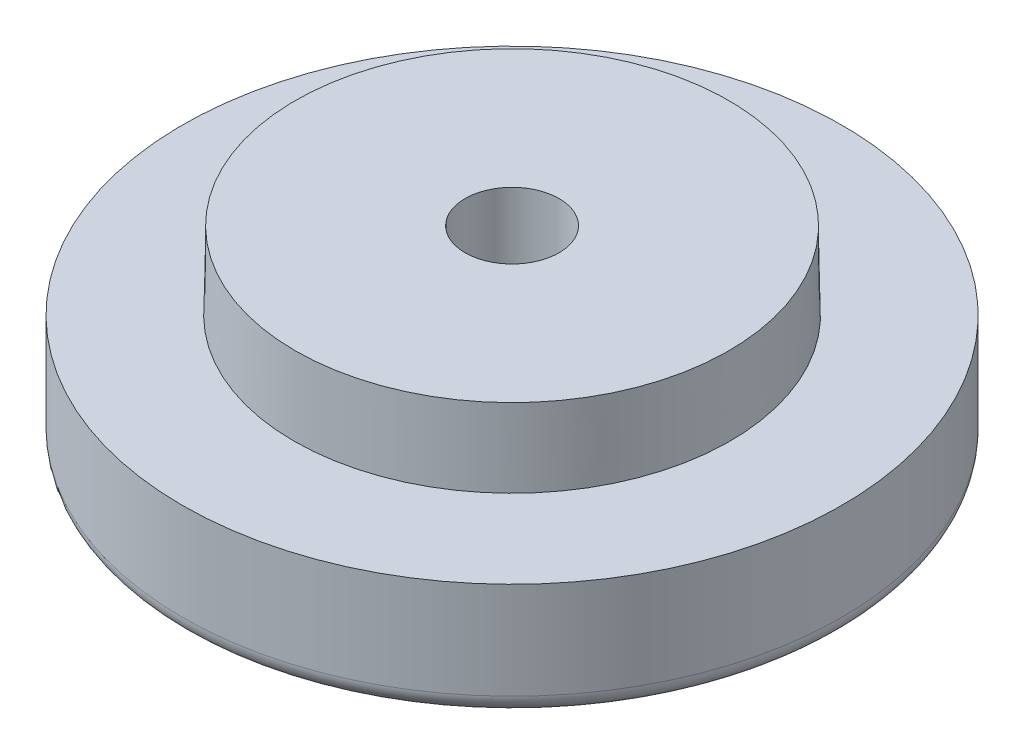
ISO-10303-21;
HEADER;
FILE_DESCRIPTION(('STEP AP214'),'2;1');
FILE_NAME('part.step','',(''),(''),'','','');
FILE_SCHEMA(('AUTOMOTIVE_DESIGN { 1 0 10303 214 1 1 1 1 }'));
ENDSEC;
DATA;
#1=APPLICATION_CONTEXT('core data for automotive mechanical design processes');
#2=APPLICATION_PROTOCOL_DEFINITION('international standard','automotive_design',2000,#1);
#3=PRODUCT_CONTEXT('',#1,'mechanical');
#4=PRODUCT('Part','Part','',(#3));
#5=PRODUCT_RELATED_PRODUCT_CATEGORY('part','',(#4));
#6=PRODUCT_DEFINITION_FORMATION('','',#4);
#7=PRODUCT_DEFINITION_CONTEXT('part definition',#1,'design');
#8=PRODUCT_DEFINITION('design','',#6,#7);
#9=PRODUCT_DEFINITION_SHAPE('','',#8);
#10=(LENGTH_UNIT() NAMED_UNIT(*) SI_UNIT(.MILLI.,.METRE.));
#11=(NAMED_UNIT(*) PLANE_ANGLE_UNIT() SI_UNIT($,.RADIAN.));
#12=(NAMED_UNIT(*) SI_UNIT($,.STERADIAN.) SOLID_ANGLE_UNIT());
#13=UNCERTAINTY_MEASURE_WITH_UNIT(LENGTH_MEASURE(1.E-05),#10,'distance_accuracy_value','');
#14=(GEOMETRIC_REPRESENTATION_CONTEXT(3) GLOBAL_UNCERTAINTY_ASSIGNED_CONTEXT((#13)) GLOBAL_UNIT_ASSIGNED_CONTEXT((#10,
#11,#12)) REPRESENTATION_CONTEXT('',''));
#15=CARTESIAN_POINT('',(0.,0.,0.));
#16=DIRECTION('',(0.,0.,1.));
#17=DIRECTION('',(1.,0.,0.));
#18=AXIS2_PLACEMENT_3D('',#15,#16,#17);
#19=CARTESIAN_POINT('',(0.,12.,0.));
#20=DIRECTION('',(0.,1.,0.));
#21=DIRECTION('',(0.,0.,1.));
#22=AXIS2_PLACEMENT_3D('',#19,#20,#21);
#23=PLANE('',#22);
#24=CARTESIAN_POINT('',(0.,12.,0.));
#25=DIRECTION('',(0.,1.,0.));
#26=DIRECTION('',(0.,0.,1.));
#27=AXIS2_PLACEMENT_3D('',#24,#25,#26);
#28=CIRCLE('',#27,4.85);
#29=CARTESIAN_POINT('',(0.,12.,4.85));
#30=VERTEX_POINT('',#29);
#31=EDGE_CURVE('E62',#30,#30,#28,.T.);
#32=ORIENTED_EDGE('',*,*,#31,.T.);
#33=EDGE_LOOP('',(#32));
#34=FACE_BOUND('',#33,.T.);
#35=CARTESIAN_POINT('',(0.,12.,0.));
#36=DIRECTION('',(0.,1.,0.));
#37=DIRECTION('',(0.,0.,1.));
#38=AXIS2_PLACEMENT_3D('',#35,#36,#37);
#39=CIRCLE('',#38,22.5);
#40=CARTESIAN_POINT('',(0.,12.,22.5));
#41=VERTEX_POINT('',#40);
#42=EDGE_CURVE('E58',#41,#41,#39,.T.);
#43=ORIENTED_EDGE('',*,*,#42,.F.);
#44=EDGE_LOOP('',(#43));
#45=FACE_BOUND('',#44,.T.);
#46=ADVANCED_FACE('F51',(#34,#45),#23,.F.);
#47=CARTESIAN_POINT('',(0.,12.,0.));
#48=DIRECTION('',(0.,-1.,0.));
#49=DIRECTION('',(0.,0.,1.));
#50=AXIS2_PLACEMENT_3D('',#47,#48,#49);
#51=CONICAL_SURFACE('',#50,22.5,0.0174532925199433);
#52=CARTESIAN_POINT('',(0.,20.,0.));
#53=DIRECTION('',(0.,1.,0.));
#54=DIRECTION('',(0.,0.,1.));
#55=AXIS2_PLACEMENT_3D('',#52,#53,#54);
#56=CIRCLE('',#55,22.3603594805743);
#57=CARTESIAN_POINT('',(0.,20.,22.3603594805743));
#58=VERTEX_POINT('',#57);
#59=EDGE_CURVE('E12',#58,#58,#56,.T.);
#60=ORIENTED_EDGE('',*,*,#59,.F.);
#61=EDGE_LOOP('',(#60));
#62=FACE_BOUND('',#61,.T.);
#63=ORIENTED_EDGE('',*,*,#42,.T.);
#64=EDGE_LOOP('',(#63));
#65=FACE_BOUND('',#64,.T.);
#66=ADVANCED_FACE('F53',(#62,#65),#51,.T.);
#67=CARTESIAN_POINT('',(0.,20.,0.));
#68=DIRECTION('',(0.,1.,0.));
#69=DIRECTION('',(0.,0.,1.));
#70=AXIS2_PLACEMENT_3D('',#67,#68,#69);
#71=PLANE('',#70);
#72=CARTESIAN_POINT('',(0.,20.,0.));
#73=DIRECTION('',(0.,1.,0.));
#74=DIRECTION('',(0.,0.,1.));
#75=AXIS2_PLACEMENT_3D('',#72,#73,#74);
#76=CIRCLE('',#75,4.85);
#77=CARTESIAN_POINT('',(0.,20.,4.85));
#78=VERTEX_POINT('',#77);
#79=EDGE_CURVE('E66',#78,#78,#76,.T.);
#80=ORIENTED_EDGE('',*,*,#79,.F.);
#81=EDGE_LOOP('',(#80));
#82=FACE_BOUND('',#81,.T.);
#83=ORIENTED_EDGE('',*,*,#59,.T.);
#84=EDGE_LOOP('',(#83));
#85=FACE_BOUND('',#84,.T.);
#86=ADVANCED_FACE('F75',(#82,#85),#71,.T.);
#87=CARTESIAN_POINT('',(0.,0.,0.));
#88=DIRECTION('',(0.,1.,0.));
#89=DIRECTION('',(0.,0.,1.));
#90=AXIS2_PLACEMENT_3D('',#87,#88,#89);
#91=CYLINDRICAL_SURFACE('',#90,4.85);
#92=ORIENTED_EDGE('',*,*,#79,.T.);
#93=EDGE_LOOP('',(#92));
#94=FACE_BOUND('',#93,.T.);
#95=ORIENTED_EDGE('',*,*,#31,.F.);
#96=EDGE_LOOP('',(#95));
#97=FACE_BOUND('',#96,.T.);
#98=ADVANCED_FACE('F72',(#94,#97),#91,.F.);
#99=CLOSED_SHELL('',(#46,#66,#86,#98));
#100=MANIFOLD_SOLID_BREP('B2',#99);
#101=CARTESIAN_POINT('',(0.,12.,0.));
#102=DIRECTION('',(0.,-1.,0.));
#103=DIRECTION('',(0.,0.,-1.));
#104=AXIS2_PLACEMENT_3D('',#101,#102,#103);
#105=CYLINDRICAL_SURFACE('',#104,34.);
#106=CARTESIAN_POINT('',(0.,2.,0.));
#107=DIRECTION('',(0.,1.,0.));
#108=DIRECTION('',(0.,0.,1.));
#109=AXIS2_PLACEMENT_3D('',#106,#107,#108);
#110=CIRCLE('',#109,34.);
#111=CARTESIAN_POINT('',(0.,2.,34.));
#112=VERTEX_POINT('',#111);
#113=EDGE_CURVE('E129',#112,#112,#110,.T.);
#114=ORIENTED_EDGE('',*,*,#113,.T.);
#115=EDGE_LOOP('',(#114));
#116=FACE_BOUND('',#115,.T.);
#117=CARTESIAN_POINT('',(0.,12.,0.));
#118=DIRECTION('',(0.,1.,0.));
#119=DIRECTION('',(0.,0.,1.));
#120=AXIS2_PLACEMENT_3D('',#117,#118,#119);
#121=CIRCLE('',#120,34.);
#122=CARTESIAN_POINT('',(0.,12.,34.));
#123=VERTEX_POINT('',#122);
#124=EDGE_CURVE('E133',#123,#123,#121,.T.);
#125=ORIENTED_EDGE('',*,*,#124,.F.);
#126=EDGE_LOOP('',(#125));
#127=FACE_BOUND('',#126,.T.);
#128=ADVANCED_FACE('F122',(#116,#127),#105,.T.);
#129=CARTESIAN_POINT('',(0.,12.,0.));
#130=DIRECTION('',(0.,1.,0.));
#131=DIRECTION('',(0.,0.,1.));
#132=AXIS2_PLACEMENT_3D('',#129,#130,#131);
#133=PLANE('',#132);
#134=CARTESIAN_POINT('',(0.,12.,0.));
#135=DIRECTION('',(0.,1.,0.));
#136=DIRECTION('',(0.,0.,1.));
#137=AXIS2_PLACEMENT_3D('',#134,#135,#136);
#138=CIRCLE('',#137,4.85);
#139=CARTESIAN_POINT('',(0.,12.,4.85));
#140=VERTEX_POINT('',#139);
#141=EDGE_CURVE('E137',#140,#140,#138,.T.);
#142=ORIENTED_EDGE('',*,*,#141,.F.);
#143=EDGE_LOOP('',(#142));
#144=FACE_BOUND('',#143,.T.);
#145=ORIENTED_EDGE('',*,*,#124,.T.);
#146=EDGE_LOOP('',(#145));
#147=FACE_BOUND('',#146,.T.);
#148=ADVANCED_FACE('F159',(#144,#147),#133,.T.);
#149=CARTESIAN_POINT('',(0.,0.,0.));
#150=DIRECTION('',(0.,1.,0.));
#151=DIRECTION('',(0.,0.,1.));
#152=AXIS2_PLACEMENT_3D('',#149,#150,#151);
#153=PLANE('',#152);
#154=CARTESIAN_POINT('',(0.,0.,0.));
#155=DIRECTION('',(0.,1.,0.));
#156=DIRECTION('',(0.,0.,1.));
#157=AXIS2_PLACEMENT_3D('',#154,#155,#156);
#158=CIRCLE('',#157,32.);
#159=CARTESIAN_POINT('',(0.,0.,32.));
#160=VERTEX_POINT('',#159);
#161=EDGE_CURVE('E50',#160,#160,#158,.F.);
#162=ORIENTED_EDGE('',*,*,#161,.T.);
#163=EDGE_LOOP('',(#162));
#164=FACE_BOUND('',#163,.T.);
#165=CARTESIAN_POINT('',(0.,0.,0.));
#166=DIRECTION('',(0.,1.,0.));
#167=DIRECTION('',(0.,0.,1.));
#168=AXIS2_PLACEMENT_3D('',#165,#166,#167);
#169=CIRCLE('',#168,4.85);
#170=CARTESIAN_POINT('',(0.,0.,4.85));
#171=VERTEX_POINT('',#170);
#172=EDGE_CURVE('E142',#171,#171,#169,.T.);
#173=ORIENTED_EDGE('',*,*,#172,.T.);
#174=EDGE_LOOP('',(#173));
#175=FACE_BOUND('',#174,.T.);
#176=ADVANCED_FACE('F146',(#164,#175),#153,.F.);
#177=CARTESIAN_POINT('',(0.,0.,0.));
#178=DIRECTION('',(0.,1.,0.));
#179=DIRECTION('',(0.,0.,1.));
#180=AXIS2_PLACEMENT_3D('',#177,#178,#179);
#181=CYLINDRICAL_SURFACE('',#180,4.85);
#182=ORIENTED_EDGE('',*,*,#141,.T.);
#183=EDGE_LOOP('',(#182));
#184=FACE_BOUND('',#183,.T.);
#185=ORIENTED_EDGE('',*,*,#172,.F.);
#186=EDGE_LOOP('',(#185));
#187=FACE_BOUND('',#186,.T.);
#188=ADVANCED_FACE('F148',(#184,#187),#181,.F.);
#189=CARTESIAN_POINT('',(0.,2.,0.));
#190=DIRECTION('',(0.,1.,0.));
#191=DIRECTION('',(0.,0.,1.));
#192=AXIS2_PLACEMENT_3D('',#189,#190,#191);
#193=TOROIDAL_SURFACE('',#192,32.,2.);
#194=ORIENTED_EDGE('',*,*,#161,.F.);
#195=EDGE_LOOP('',(#194));
#196=FACE_BOUND('',#195,.T.);
#197=ORIENTED_EDGE('',*,*,#113,.F.);
#198=EDGE_LOOP('',(#197));
#199=FACE_BOUND('',#198,.T.);
#200=ADVANCED_FACE('F124',(#196,#199),#193,.T.);
#201=CLOSED_SHELL('',(#128,#148,#176,#188,#200));
#202=MANIFOLD_SOLID_BREP('B7',#201);
#203=ADVANCED_BREP_SHAPE_REPRESENTATION('',(#18,#100,#202),#14);
#204=SHAPE_DEFINITION_REPRESENTATION(#9,#203);
ENDSEC;
END-ISO-10303-21;
